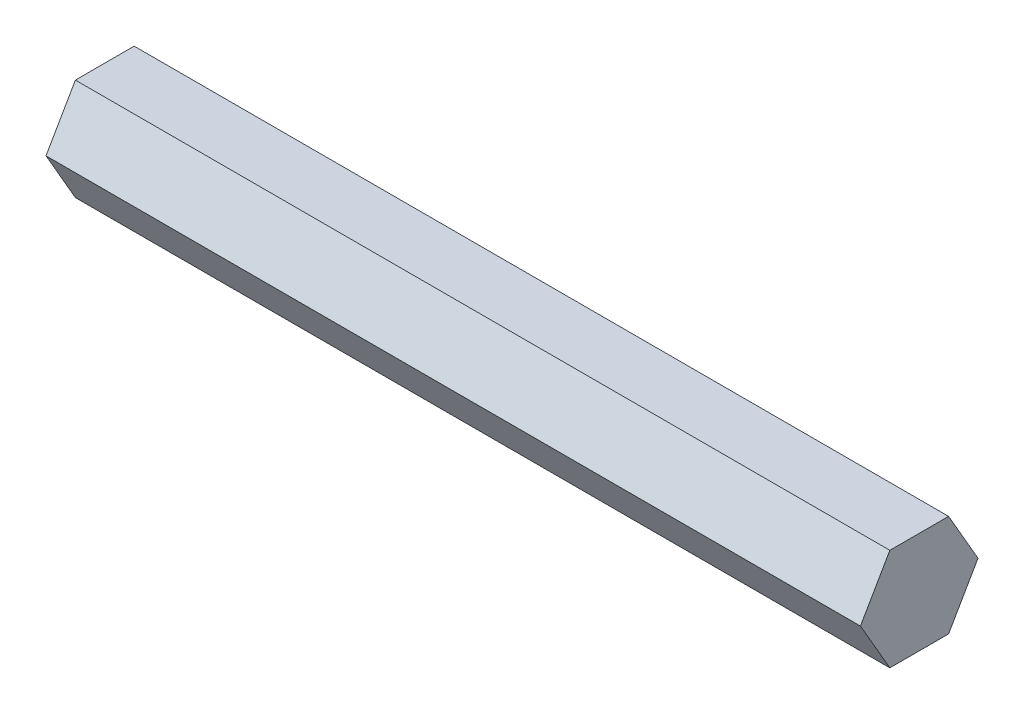
ISO-10303-21;
HEADER;
FILE_DESCRIPTION(('STEP AP214'),'2;1');
FILE_NAME('part.step','',(''),(''),'','','');
FILE_SCHEMA(('AUTOMOTIVE_DESIGN { 1 0 10303 214 1 1 1 1 }'));
ENDSEC;
DATA;
#1=APPLICATION_CONTEXT('core data for automotive mechanical design processes');
#2=APPLICATION_PROTOCOL_DEFINITION('international standard','automotive_design',2000,#1);
#3=PRODUCT_CONTEXT('',#1,'mechanical');
#4=PRODUCT('Part','Part','',(#3));
#5=PRODUCT_RELATED_PRODUCT_CATEGORY('part','',(#4));
#6=PRODUCT_DEFINITION_FORMATION('','',#4);
#7=PRODUCT_DEFINITION_CONTEXT('part definition',#1,'design');
#8=PRODUCT_DEFINITION('design','',#6,#7);
#9=PRODUCT_DEFINITION_SHAPE('','',#8);
#10=(LENGTH_UNIT() NAMED_UNIT(*) SI_UNIT(.MILLI.,.METRE.));
#11=(NAMED_UNIT(*) PLANE_ANGLE_UNIT() SI_UNIT($,.RADIAN.));
#12=(NAMED_UNIT(*) SI_UNIT($,.STERADIAN.) SOLID_ANGLE_UNIT());
#13=UNCERTAINTY_MEASURE_WITH_UNIT(LENGTH_MEASURE(1.E-05),#10,'distance_accuracy_value','');
#14=(GEOMETRIC_REPRESENTATION_CONTEXT(3) GLOBAL_UNCERTAINTY_ASSIGNED_CONTEXT((#13)) GLOBAL_UNIT_ASSIGNED_CONTEXT((#10,
#11,#12)) REPRESENTATION_CONTEXT('',''));
#15=CARTESIAN_POINT('',(0.,0.,0.));
#16=DIRECTION('',(0.,0.,1.));
#17=DIRECTION('',(1.,0.,0.));
#18=AXIS2_PLACEMENT_3D('',#15,#16,#17);
#19=CARTESIAN_POINT('',(50.8,-6.34999999999992,-3.66617420935418));
#20=DIRECTION('',(0.,0.499999999999995,0.866025403784441));
#21=DIRECTION('',(0.,-0.866025403784441,0.499999999999995));
#22=AXIS2_PLACEMENT_3D('',#19,#20,#21);
#23=PLANE('',#22);
#24=DIRECTION('',(0.,0.866025403784441,-0.499999999999995));
#25=VECTOR('',#24,1.);
#26=CARTESIAN_POINT('',(-50.8,-6.34999999999992,-3.66617420935418));
#27=LINE('',#26,#25);
#28=CARTESIAN_POINT('',(-50.8,-6.34999999999992,-3.66617420935418));
#29=VERTEX_POINT('',#28);
#30=CARTESIAN_POINT('',(-50.8,0.,-7.33234841870821));
#31=VERTEX_POINT('',#30);
#32=EDGE_CURVE('E134',#29,#31,#27,.T.);
#33=ORIENTED_EDGE('',*,*,#32,.T.);
#34=DIRECTION('',(-1.,0.,0.));
#35=VECTOR('',#34,1.);
#36=CARTESIAN_POINT('',(50.8,0.,-7.33234841870821));
#37=LINE('',#36,#35);
#38=CARTESIAN_POINT('',(50.8,0.,-7.33234841870821));
#39=VERTEX_POINT('',#38);
#40=EDGE_CURVE('E11',#39,#31,#37,.T.);
#41=ORIENTED_EDGE('',*,*,#40,.F.);
#42=DIRECTION('',(0.,0.866025403784441,-0.499999999999995));
#43=VECTOR('',#42,1.);
#44=CARTESIAN_POINT('',(50.8,-6.34999999999992,-3.66617420935418));
#45=LINE('',#44,#43);
#46=CARTESIAN_POINT('',(50.8,-6.34999999999992,-3.66617420935418));
#47=VERTEX_POINT('',#46);
#48=EDGE_CURVE('E150',#47,#39,#45,.T.);
#49=ORIENTED_EDGE('',*,*,#48,.F.);
#50=DIRECTION('',(-1.,0.,0.));
#51=VECTOR('',#50,1.);
#52=CARTESIAN_POINT('',(50.8,-6.34999999999992,-3.66617420935418));
#53=LINE('',#52,#51);
#54=EDGE_CURVE('E130',#47,#29,#53,.T.);
#55=ORIENTED_EDGE('',*,*,#54,.T.);
#56=EDGE_LOOP('',(#33,#41,#49,#55));
#57=FACE_BOUND('',#56,.T.);
#58=ADVANCED_FACE('F45',(#57),#23,.F.);
#59=CARTESIAN_POINT('',(50.8,0.,-7.33234841870821));
#60=DIRECTION('',(0.,-0.500000000000001,0.866025403784438));
#61=DIRECTION('',(0.,-0.866025403784438,-0.500000000000001));
#62=AXIS2_PLACEMENT_3D('',#59,#60,#61);
#63=PLANE('',#62);
#64=DIRECTION('',(0.,0.866025403784438,0.500000000000001));
#65=VECTOR('',#64,1.);
#66=CARTESIAN_POINT('',(-50.8,0.,-7.33234841870821));
#67=LINE('',#66,#65);
#68=CARTESIAN_POINT('',(-50.8,6.34999999999997,-3.66617420935409));
#69=VERTEX_POINT('',#68);
#70=EDGE_CURVE('E138',#31,#69,#67,.T.);
#71=ORIENTED_EDGE('',*,*,#70,.T.);
#72=DIRECTION('',(-1.,0.,0.));
#73=VECTOR('',#72,1.);
#74=CARTESIAN_POINT('',(50.8,6.34999999999997,-3.66617420935409));
#75=LINE('',#74,#73);
#76=CARTESIAN_POINT('',(50.8,6.34999999999997,-3.66617420935409));
#77=VERTEX_POINT('',#76);
#78=EDGE_CURVE('E54',#77,#69,#75,.T.);
#79=ORIENTED_EDGE('',*,*,#78,.F.);
#80=DIRECTION('',(0.,0.866025403784438,0.500000000000001));
#81=VECTOR('',#80,1.);
#82=CARTESIAN_POINT('',(50.8,0.,-7.33234841870821));
#83=LINE('',#82,#81);
#84=EDGE_CURVE('E99',#39,#77,#83,.T.);
#85=ORIENTED_EDGE('',*,*,#84,.F.);
#86=ORIENTED_EDGE('',*,*,#40,.T.);
#87=EDGE_LOOP('',(#71,#79,#85,#86));
#88=FACE_BOUND('',#87,.T.);
#89=ADVANCED_FACE('F178',(#88),#63,.F.);
#90=CARTESIAN_POINT('',(50.8,6.34999999999997,-3.66617420935409));
#91=DIRECTION('',(0.,-1.,0.));
#92=DIRECTION('',(0.,0.,-1.));
#93=AXIS2_PLACEMENT_3D('',#90,#91,#92);
#94=PLANE('',#93);
#95=DIRECTION('',(0.,0.,1.));
#96=VECTOR('',#95,1.);
#97=CARTESIAN_POINT('',(-50.8,6.34999999999997,-3.66617420935409));
#98=LINE('',#97,#96);
#99=CARTESIAN_POINT('',(-50.8,6.34999999999995,3.66617420935413));
#100=VERTEX_POINT('',#99);
#101=EDGE_CURVE('E141',#69,#100,#98,.T.);
#102=ORIENTED_EDGE('',*,*,#101,.T.);
#103=DIRECTION('',(-1.,0.,0.));
#104=VECTOR('',#103,1.);
#105=CARTESIAN_POINT('',(50.8,6.34999999999995,3.66617420935413));
#106=LINE('',#105,#104);
#107=CARTESIAN_POINT('',(50.8,6.34999999999995,3.66617420935413));
#108=VERTEX_POINT('',#107);
#109=EDGE_CURVE('E123',#108,#100,#106,.T.);
#110=ORIENTED_EDGE('',*,*,#109,.F.);
#111=DIRECTION('',(0.,0.,1.));
#112=VECTOR('',#111,1.);
#113=CARTESIAN_POINT('',(50.8,6.34999999999997,-3.66617420935409));
#114=LINE('',#113,#112);
#115=EDGE_CURVE('E112',#77,#108,#114,.T.);
#116=ORIENTED_EDGE('',*,*,#115,.F.);
#117=ORIENTED_EDGE('',*,*,#78,.T.);
#118=EDGE_LOOP('',(#102,#110,#116,#117));
#119=FACE_BOUND('',#118,.T.);
#120=ADVANCED_FACE('F160',(#119),#94,.F.);
#121=CARTESIAN_POINT('',(50.8,6.34999999999995,3.66617420935413));
#122=DIRECTION('',(0.,-0.499999999999995,-0.866025403784442));
#123=DIRECTION('',(0.,0.866025403784442,-0.499999999999995));
#124=AXIS2_PLACEMENT_3D('',#121,#122,#123);
#125=PLANE('',#124);
#126=DIRECTION('',(0.,-0.866025403784441,0.499999999999995));
#127=VECTOR('',#126,1.);
#128=CARTESIAN_POINT('',(-50.8,6.34999999999995,3.66617420935413));
#129=LINE('',#128,#127);
#130=CARTESIAN_POINT('',(-50.8,0.,7.33234841870821));
#131=VERTEX_POINT('',#130);
#132=EDGE_CURVE('E121',#100,#131,#129,.T.);
#133=ORIENTED_EDGE('',*,*,#132,.T.);
#134=DIRECTION('',(-1.,0.,0.));
#135=VECTOR('',#134,1.);
#136=CARTESIAN_POINT('',(50.8,0.,7.33234841870821));
#137=LINE('',#136,#135);
#138=CARTESIAN_POINT('',(50.8,0.,7.33234841870821));
#139=VERTEX_POINT('',#138);
#140=EDGE_CURVE('E118',#139,#131,#137,.T.);
#141=ORIENTED_EDGE('',*,*,#140,.F.);
#142=DIRECTION('',(0.,-0.866025403784441,0.499999999999995));
#143=VECTOR('',#142,1.);
#144=CARTESIAN_POINT('',(50.8,6.34999999999995,3.66617420935413));
#145=LINE('',#144,#143);
#146=EDGE_CURVE('E106',#108,#139,#145,.T.);
#147=ORIENTED_EDGE('',*,*,#146,.F.);
#148=ORIENTED_EDGE('',*,*,#109,.T.);
#149=EDGE_LOOP('',(#133,#141,#147,#148));
#150=FACE_BOUND('',#149,.T.);
#151=ADVANCED_FACE('F119',(#150),#125,.F.);
#152=CARTESIAN_POINT('',(50.8,0.,7.33234841870821));
#153=DIRECTION('',(0.,0.500000000000007,-0.866025403784435));
#154=DIRECTION('',(0.,0.866025403784435,0.500000000000007));
#155=AXIS2_PLACEMENT_3D('',#152,#153,#154);
#156=PLANE('',#155);
#157=DIRECTION('',(0.,-0.866025403784435,-0.500000000000007));
#158=VECTOR('',#157,1.);
#159=CARTESIAN_POINT('',(-50.8,0.,7.33234841870821));
#160=LINE('',#159,#158);
#161=CARTESIAN_POINT('',(-50.8,-6.35,3.66617420935404));
#162=VERTEX_POINT('',#161);
#163=EDGE_CURVE('E85',#131,#162,#160,.T.);
#164=ORIENTED_EDGE('',*,*,#163,.T.);
#165=DIRECTION('',(-1.,0.,0.));
#166=VECTOR('',#165,1.);
#167=CARTESIAN_POINT('',(50.8,-6.35,3.66617420935404));
#168=LINE('',#167,#166);
#169=CARTESIAN_POINT('',(50.8,-6.35,3.66617420935404));
#170=VERTEX_POINT('',#169);
#171=EDGE_CURVE('E124',#170,#162,#168,.T.);
#172=ORIENTED_EDGE('',*,*,#171,.F.);
#173=DIRECTION('',(0.,-0.866025403784435,-0.500000000000007));
#174=VECTOR('',#173,1.);
#175=CARTESIAN_POINT('',(50.8,0.,7.33234841870821));
#176=LINE('',#175,#174);
#177=EDGE_CURVE('E110',#139,#170,#176,.T.);
#178=ORIENTED_EDGE('',*,*,#177,.F.);
#179=ORIENTED_EDGE('',*,*,#140,.T.);
#180=EDGE_LOOP('',(#164,#172,#178,#179));
#181=FACE_BOUND('',#180,.T.);
#182=ADVANCED_FACE('F126',(#181),#156,.F.);
#183=CARTESIAN_POINT('',(50.8,-6.35,3.66617420935404));
#184=DIRECTION('',(0.,1.,0.));
#185=DIRECTION('',(0.,0.,1.));
#186=AXIS2_PLACEMENT_3D('',#183,#184,#185);
#187=PLANE('',#186);
#188=DIRECTION('',(0.,0.,-1.));
#189=VECTOR('',#188,1.);
#190=CARTESIAN_POINT('',(-50.8,-6.35,3.66617420935404));
#191=LINE('',#190,#189);
#192=EDGE_CURVE('E91',#162,#29,#191,.T.);
#193=ORIENTED_EDGE('',*,*,#192,.T.);
#194=ORIENTED_EDGE('',*,*,#54,.F.);
#195=DIRECTION('',(0.,0.,-1.));
#196=VECTOR('',#195,1.);
#197=CARTESIAN_POINT('',(50.8,-6.35,3.66617420935404));
#198=LINE('',#197,#196);
#199=EDGE_CURVE('E62',#170,#47,#198,.T.);
#200=ORIENTED_EDGE('',*,*,#199,.F.);
#201=ORIENTED_EDGE('',*,*,#171,.T.);
#202=EDGE_LOOP('',(#193,#194,#200,#201));
#203=FACE_BOUND('',#202,.T.);
#204=ADVANCED_FACE('F167',(#203),#187,.F.);
#205=CARTESIAN_POINT('',(50.8,0.,0.));
#206=DIRECTION('',(1.,0.,0.));
#207=DIRECTION('',(0.,0.,-1.));
#208=AXIS2_PLACEMENT_3D('',#205,#206,#207);
#209=PLANE('',#208);
#210=ORIENTED_EDGE('',*,*,#48,.T.);
#211=ORIENTED_EDGE('',*,*,#84,.T.);
#212=ORIENTED_EDGE('',*,*,#115,.T.);
#213=ORIENTED_EDGE('',*,*,#146,.T.);
#214=ORIENTED_EDGE('',*,*,#177,.T.);
#215=ORIENTED_EDGE('',*,*,#199,.T.);
#216=EDGE_LOOP('',(#210,#211,#212,#213,#214,#215));
#217=FACE_BOUND('',#216,.T.);
#218=ADVANCED_FACE('F108',(#217),#209,.T.);
#219=CARTESIAN_POINT('',(-50.8,0.,0.));
#220=DIRECTION('',(1.,0.,0.));
#221=DIRECTION('',(0.,0.,-1.));
#222=AXIS2_PLACEMENT_3D('',#219,#220,#221);
#223=PLANE('',#222);
#224=ORIENTED_EDGE('',*,*,#32,.F.);
#225=ORIENTED_EDGE('',*,*,#192,.F.);
#226=ORIENTED_EDGE('',*,*,#163,.F.);
#227=ORIENTED_EDGE('',*,*,#132,.F.);
#228=ORIENTED_EDGE('',*,*,#101,.F.);
#229=ORIENTED_EDGE('',*,*,#70,.F.);
#230=EDGE_LOOP('',(#224,#225,#226,#227,#228,#229));
#231=FACE_BOUND('',#230,.T.);
#232=ADVANCED_FACE('F163',(#231),#223,.F.);
#233=CLOSED_SHELL('',(#58,#89,#120,#151,#182,#204,#218,#232));
#234=MANIFOLD_SOLID_BREP('B2',#233);
#235=ADVANCED_BREP_SHAPE_REPRESENTATION('',(#18,#234),#14);
#236=SHAPE_DEFINITION_REPRESENTATION(#9,#235);
ENDSEC;
END-ISO-10303-21;
